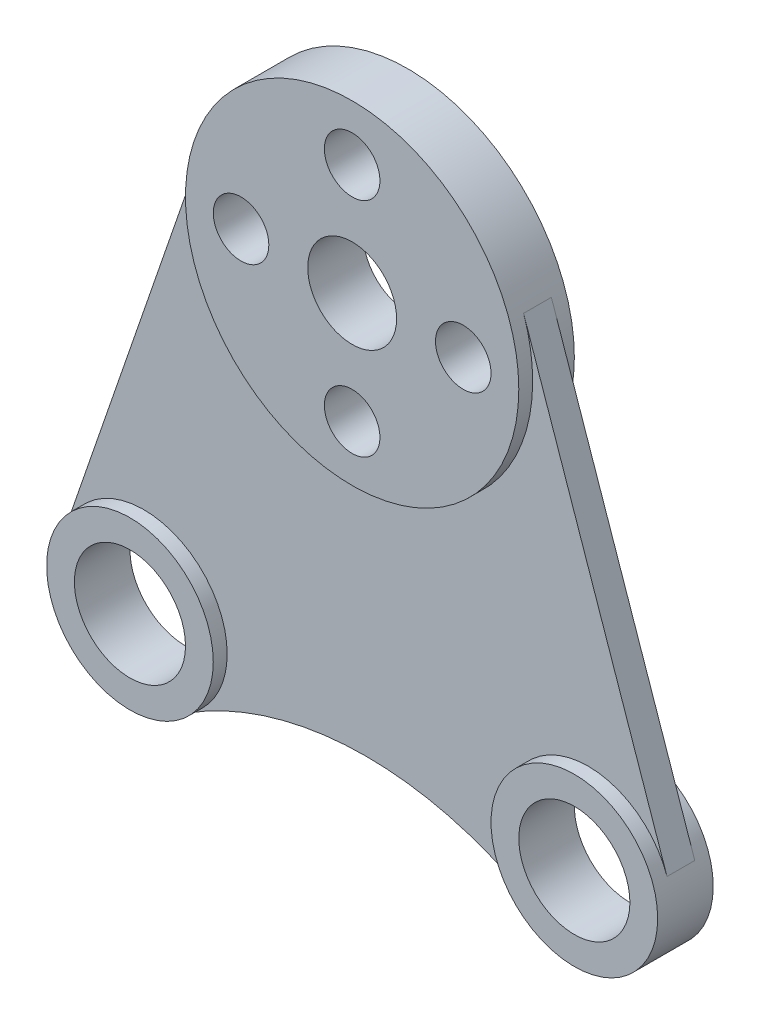
ISO-10303-21;
HEADER;
FILE_DESCRIPTION(('STEP AP214'),'2;1');
FILE_NAME('part.step','',(''),(''),'','','');
FILE_SCHEMA(('AUTOMOTIVE_DESIGN { 1 0 10303 214 1 1 1 1 }'));
ENDSEC;
DATA;
#1=APPLICATION_CONTEXT('core data for automotive mechanical design processes');
#2=APPLICATION_PROTOCOL_DEFINITION('international standard','automotive_design',2000,#1);
#3=PRODUCT_CONTEXT('',#1,'mechanical');
#4=PRODUCT('Part','Part','',(#3));
#5=PRODUCT_RELATED_PRODUCT_CATEGORY('part','',(#4));
#6=PRODUCT_DEFINITION_FORMATION('','',#4);
#7=PRODUCT_DEFINITION_CONTEXT('part definition',#1,'design');
#8=PRODUCT_DEFINITION('design','',#6,#7);
#9=PRODUCT_DEFINITION_SHAPE('','',#8);
#10=(LENGTH_UNIT() NAMED_UNIT(*) SI_UNIT(.MILLI.,.METRE.));
#11=(NAMED_UNIT(*) PLANE_ANGLE_UNIT() SI_UNIT($,.RADIAN.));
#12=(NAMED_UNIT(*) SI_UNIT($,.STERADIAN.) SOLID_ANGLE_UNIT());
#13=UNCERTAINTY_MEASURE_WITH_UNIT(LENGTH_MEASURE(1.E-05),#10,'distance_accuracy_value','');
#14=(GEOMETRIC_REPRESENTATION_CONTEXT(3) GLOBAL_UNCERTAINTY_ASSIGNED_CONTEXT((#13)) GLOBAL_UNIT_ASSIGNED_CONTEXT((#10,
#11,#12)) REPRESENTATION_CONTEXT('',''));
#15=CARTESIAN_POINT('',(0.,0.,0.));
#16=DIRECTION('',(0.,0.,1.));
#17=DIRECTION('',(1.,0.,0.));
#18=AXIS2_PLACEMENT_3D('',#15,#16,#17);
#19=CARTESIAN_POINT('',(0.,0.,5.));
#20=DIRECTION('',(0.,0.,-1.));
#21=DIRECTION('',(-1.,0.,0.));
#22=AXIS2_PLACEMENT_3D('',#19,#20,#21);
#23=CYLINDRICAL_SURFACE('',#22,8.);
#24=CARTESIAN_POINT('',(0.,0.,5.));
#25=DIRECTION('',(0.,0.,1.));
#26=DIRECTION('',(1.,0.,0.));
#27=AXIS2_PLACEMENT_3D('',#24,#25,#26);
#28=CIRCLE('',#27,8.);
#29=CARTESIAN_POINT('',(8.,0.,5.));
#30=VERTEX_POINT('',#29);
#31=EDGE_CURVE('E53',#30,#30,#28,.T.);
#32=ORIENTED_EDGE('',*,*,#31,.T.);
#33=EDGE_LOOP('',(#32));
#34=FACE_BOUND('',#33,.T.);
#35=CARTESIAN_POINT('',(0.,0.,-5.));
#36=DIRECTION('',(0.,0.,1.));
#37=DIRECTION('',(1.,0.,0.));
#38=AXIS2_PLACEMENT_3D('',#35,#36,#37);
#39=CIRCLE('',#38,8.);
#40=CARTESIAN_POINT('',(8.,0.,-5.));
#41=VERTEX_POINT('',#40);
#42=EDGE_CURVE('E188',#41,#41,#39,.T.);
#43=ORIENTED_EDGE('',*,*,#42,.F.);
#44=EDGE_LOOP('',(#43));
#45=FACE_BOUND('',#44,.T.);
#46=ADVANCED_FACE('F43',(#34,#45),#23,.F.);
#47=CARTESIAN_POINT('',(0.,20.,5.));
#48=DIRECTION('',(0.,0.,-1.));
#49=DIRECTION('',(-1.,0.,0.));
#50=AXIS2_PLACEMENT_3D('',#47,#48,#49);
#51=CYLINDRICAL_SURFACE('',#50,5.);
#52=CARTESIAN_POINT('',(0.,20.,5.));
#53=DIRECTION('',(0.,0.,1.));
#54=DIRECTION('',(1.,0.,0.));
#55=AXIS2_PLACEMENT_3D('',#52,#53,#54);
#56=CIRCLE('',#55,5.);
#57=CARTESIAN_POINT('',(5.,20.,5.));
#58=VERTEX_POINT('',#57);
#59=EDGE_CURVE('E167',#58,#58,#56,.T.);
#60=ORIENTED_EDGE('',*,*,#59,.T.);
#61=EDGE_LOOP('',(#60));
#62=FACE_BOUND('',#61,.T.);
#63=CARTESIAN_POINT('',(0.,20.,-5.));
#64=DIRECTION('',(0.,0.,1.));
#65=DIRECTION('',(1.,0.,0.));
#66=AXIS2_PLACEMENT_3D('',#63,#64,#65);
#67=CIRCLE('',#66,5.);
#68=CARTESIAN_POINT('',(5.,20.,-5.));
#69=VERTEX_POINT('',#68);
#70=EDGE_CURVE('E185',#69,#69,#67,.T.);
#71=ORIENTED_EDGE('',*,*,#70,.F.);
#72=EDGE_LOOP('',(#71));
#73=FACE_BOUND('',#72,.T.);
#74=ADVANCED_FACE('F216',(#62,#73),#51,.F.);
#75=CARTESIAN_POINT('',(20.,0.,5.));
#76=DIRECTION('',(0.,0.,-1.));
#77=DIRECTION('',(-1.,0.,0.));
#78=AXIS2_PLACEMENT_3D('',#75,#76,#77);
#79=CYLINDRICAL_SURFACE('',#78,5.00000000000006);
#80=CARTESIAN_POINT('',(20.,0.,5.));
#81=DIRECTION('',(0.,0.,1.));
#82=DIRECTION('',(1.,0.,0.));
#83=AXIS2_PLACEMENT_3D('',#80,#81,#82);
#84=CIRCLE('',#83,5.00000000000006);
#85=CARTESIAN_POINT('',(25.0000000000001,0.,5.));
#86=VERTEX_POINT('',#85);
#87=EDGE_CURVE('E163',#86,#86,#84,.T.);
#88=ORIENTED_EDGE('',*,*,#87,.T.);
#89=EDGE_LOOP('',(#88));
#90=FACE_BOUND('',#89,.T.);
#91=CARTESIAN_POINT('',(20.,0.,-5.));
#92=DIRECTION('',(0.,0.,1.));
#93=DIRECTION('',(1.,0.,0.));
#94=AXIS2_PLACEMENT_3D('',#91,#92,#93);
#95=CIRCLE('',#94,5.00000000000006);
#96=CARTESIAN_POINT('',(25.0000000000001,0.,-5.));
#97=VERTEX_POINT('',#96);
#98=EDGE_CURVE('E181',#97,#97,#95,.T.);
#99=ORIENTED_EDGE('',*,*,#98,.F.);
#100=EDGE_LOOP('',(#99));
#101=FACE_BOUND('',#100,.T.);
#102=ADVANCED_FACE('F222',(#90,#101),#79,.F.);
#103=CARTESIAN_POINT('',(0.,-20.,5.));
#104=DIRECTION('',(0.,0.,-1.));
#105=DIRECTION('',(-1.,0.,0.));
#106=AXIS2_PLACEMENT_3D('',#103,#104,#105);
#107=CYLINDRICAL_SURFACE('',#106,5.00000000000014);
#108=CARTESIAN_POINT('',(0.,-20.,5.));
#109=DIRECTION('',(0.,0.,1.));
#110=DIRECTION('',(1.,0.,0.));
#111=AXIS2_PLACEMENT_3D('',#108,#109,#110);
#112=CIRCLE('',#111,5.00000000000014);
#113=CARTESIAN_POINT('',(5.00000000000014,-20.,5.));
#114=VERTEX_POINT('',#113);
#115=EDGE_CURVE('E159',#114,#114,#112,.T.);
#116=ORIENTED_EDGE('',*,*,#115,.T.);
#117=EDGE_LOOP('',(#116));
#118=FACE_BOUND('',#117,.T.);
#119=CARTESIAN_POINT('',(0.,-20.,-5.));
#120=DIRECTION('',(0.,0.,1.));
#121=DIRECTION('',(1.,0.,0.));
#122=AXIS2_PLACEMENT_3D('',#119,#120,#121);
#123=CIRCLE('',#122,5.00000000000014);
#124=CARTESIAN_POINT('',(5.00000000000014,-20.,-5.));
#125=VERTEX_POINT('',#124);
#126=EDGE_CURVE('E177',#125,#125,#123,.T.);
#127=ORIENTED_EDGE('',*,*,#126,.F.);
#128=EDGE_LOOP('',(#127));
#129=FACE_BOUND('',#128,.T.);
#130=ADVANCED_FACE('F228',(#118,#129),#107,.F.);
#131=CARTESIAN_POINT('',(-20.,0.,5.));
#132=DIRECTION('',(0.,0.,-1.));
#133=DIRECTION('',(-1.,0.,0.));
#134=AXIS2_PLACEMENT_3D('',#131,#132,#133);
#135=CYLINDRICAL_SURFACE('',#134,5.0000000000002);
#136=CARTESIAN_POINT('',(-20.,0.,5.));
#137=DIRECTION('',(0.,0.,1.));
#138=DIRECTION('',(1.,0.,0.));
#139=AXIS2_PLACEMENT_3D('',#136,#137,#138);
#140=CIRCLE('',#139,5.0000000000002);
#141=CARTESIAN_POINT('',(-14.9999999999998,0.,5.));
#142=VERTEX_POINT('',#141);
#143=EDGE_CURVE('E155',#142,#142,#140,.T.);
#144=ORIENTED_EDGE('',*,*,#143,.T.);
#145=EDGE_LOOP('',(#144));
#146=FACE_BOUND('',#145,.T.);
#147=CARTESIAN_POINT('',(-20.,0.,-5.));
#148=DIRECTION('',(0.,0.,1.));
#149=DIRECTION('',(1.,0.,0.));
#150=AXIS2_PLACEMENT_3D('',#147,#148,#149);
#151=CIRCLE('',#150,5.0000000000002);
#152=CARTESIAN_POINT('',(-14.9999999999998,0.,-5.));
#153=VERTEX_POINT('',#152);
#154=EDGE_CURVE('E154',#153,#153,#151,.T.);
#155=ORIENTED_EDGE('',*,*,#154,.F.);
#156=EDGE_LOOP('',(#155));
#157=FACE_BOUND('',#156,.T.);
#158=ADVANCED_FACE('F45',(#146,#157),#135,.F.);
#159=CARTESIAN_POINT('',(0.,0.,5.));
#160=DIRECTION('',(0.,0.,-1.));
#161=DIRECTION('',(-1.,0.,0.));
#162=AXIS2_PLACEMENT_3D('',#159,#160,#161);
#163=CYLINDRICAL_SURFACE('',#162,30.);
#164=DIRECTION('',(0.,0.,-1.));
#165=VECTOR('',#164,1.);
#166=CARTESIAN_POINT('',(-28.3617361440655,9.77813493946602,2.5));
#167=LINE('',#166,#165);
#168=CARTESIAN_POINT('',(-28.3617361440655,9.77813493946602,2.5));
#169=VERTEX_POINT('',#168);
#170=CARTESIAN_POINT('',(-28.3617361440655,9.77813493946602,-2.5));
#171=VERTEX_POINT('',#170);
#172=EDGE_CURVE('E66',#169,#171,#167,.T.);
#173=ORIENTED_EDGE('',*,*,#172,.F.);
#174=CARTESIAN_POINT('',(0.,0.,2.5));
#175=DIRECTION('',(0.,0.,1.));
#176=DIRECTION('',(1.,0.,0.));
#177=AXIS2_PLACEMENT_3D('',#174,#175,#176);
#178=CIRCLE('',#177,30.);
#179=CARTESIAN_POINT('',(28.3617361440655,9.77813493946602,2.5));
#180=VERTEX_POINT('',#179);
#181=EDGE_CURVE('E61',#169,#180,#178,.T.);
#182=ORIENTED_EDGE('',*,*,#181,.T.);
#183=DIRECTION('',(0.,0.,-1.));
#184=VECTOR('',#183,1.);
#185=CARTESIAN_POINT('',(28.3617361440655,9.77813493946602,2.5));
#186=LINE('',#185,#184);
#187=CARTESIAN_POINT('',(28.3617361440655,9.77813493946602,-2.5));
#188=VERTEX_POINT('',#187);
#189=EDGE_CURVE('E121',#180,#188,#186,.T.);
#190=ORIENTED_EDGE('',*,*,#189,.T.);
#191=CARTESIAN_POINT('',(0.,0.,-2.5));
#192=DIRECTION('',(0.,0.,1.));
#193=DIRECTION('',(1.,0.,0.));
#194=AXIS2_PLACEMENT_3D('',#191,#192,#193);
#195=CIRCLE('',#194,30.);
#196=EDGE_CURVE('E107',#171,#188,#195,.T.);
#197=ORIENTED_EDGE('',*,*,#196,.F.);
#198=EDGE_LOOP('',(#173,#182,#190,#197));
#199=FACE_BOUND('',#198,.T.);
#200=CARTESIAN_POINT('',(0.,0.,5.));
#201=DIRECTION('',(0.,0.,1.));
#202=DIRECTION('',(1.,0.,0.));
#203=AXIS2_PLACEMENT_3D('',#200,#201,#202);
#204=CIRCLE('',#203,30.);
#205=CARTESIAN_POINT('',(30.,0.,5.));
#206=VERTEX_POINT('',#205);
#207=EDGE_CURVE('E11',#206,#206,#204,.T.);
#208=ORIENTED_EDGE('',*,*,#207,.F.);
#209=EDGE_LOOP('',(#208));
#210=FACE_BOUND('',#209,.T.);
#211=CARTESIAN_POINT('',(0.,0.,-5.));
#212=DIRECTION('',(0.,0.,1.));
#213=DIRECTION('',(1.,0.,0.));
#214=AXIS2_PLACEMENT_3D('',#211,#212,#213);
#215=CIRCLE('',#214,30.);
#216=CARTESIAN_POINT('',(30.,0.,-5.));
#217=VERTEX_POINT('',#216);
#218=EDGE_CURVE('E47',#217,#217,#215,.T.);
#219=ORIENTED_EDGE('',*,*,#218,.T.);
#220=EDGE_LOOP('',(#219));
#221=FACE_BOUND('',#220,.T.);
#222=ADVANCED_FACE('F197',(#199,#210,#221),#163,.T.);
#223=CARTESIAN_POINT('',(0.,0.,5.));
#224=DIRECTION('',(0.,0.,1.));
#225=DIRECTION('',(1.,0.,0.));
#226=AXIS2_PLACEMENT_3D('',#223,#224,#225);
#227=PLANE('',#226);
#228=ORIENTED_EDGE('',*,*,#143,.F.);
#229=EDGE_LOOP('',(#228));
#230=FACE_BOUND('',#229,.T.);
#231=ORIENTED_EDGE('',*,*,#115,.F.);
#232=EDGE_LOOP('',(#231));
#233=FACE_BOUND('',#232,.T.);
#234=ORIENTED_EDGE('',*,*,#87,.F.);
#235=EDGE_LOOP('',(#234));
#236=FACE_BOUND('',#235,.T.);
#237=ORIENTED_EDGE('',*,*,#59,.F.);
#238=EDGE_LOOP('',(#237));
#239=FACE_BOUND('',#238,.T.);
#240=ORIENTED_EDGE('',*,*,#31,.F.);
#241=EDGE_LOOP('',(#240));
#242=FACE_BOUND('',#241,.T.);
#243=ORIENTED_EDGE('',*,*,#207,.T.);
#244=EDGE_LOOP('',(#243));
#245=FACE_BOUND('',#244,.T.);
#246=ADVANCED_FACE('F202',(#230,#233,#236,#239,#242,#245),#227,.T.);
#247=CARTESIAN_POINT('',(0.,0.,-5.));
#248=DIRECTION('',(0.,0.,1.));
#249=DIRECTION('',(1.,0.,0.));
#250=AXIS2_PLACEMENT_3D('',#247,#248,#249);
#251=PLANE('',#250);
#252=ORIENTED_EDGE('',*,*,#154,.T.);
#253=EDGE_LOOP('',(#252));
#254=FACE_BOUND('',#253,.T.);
#255=ORIENTED_EDGE('',*,*,#126,.T.);
#256=EDGE_LOOP('',(#255));
#257=FACE_BOUND('',#256,.T.);
#258=ORIENTED_EDGE('',*,*,#98,.T.);
#259=EDGE_LOOP('',(#258));
#260=FACE_BOUND('',#259,.T.);
#261=ORIENTED_EDGE('',*,*,#70,.T.);
#262=EDGE_LOOP('',(#261));
#263=FACE_BOUND('',#262,.T.);
#264=ORIENTED_EDGE('',*,*,#42,.T.);
#265=EDGE_LOOP('',(#264));
#266=FACE_BOUND('',#265,.T.);
#267=ORIENTED_EDGE('',*,*,#218,.F.);
#268=EDGE_LOOP('',(#267));
#269=FACE_BOUND('',#268,.T.);
#270=ADVANCED_FACE('F199',(#254,#257,#260,#263,#266,#269),#251,.F.);
#271=CARTESIAN_POINT('',(0.,-133.442887702248,2.5));
#272=DIRECTION('',(0.,0.,-1.));
#273=DIRECTION('',(-1.,0.,0.));
#274=AXIS2_PLACEMENT_3D('',#271,#272,#273);
#275=CYLINDRICAL_SURFACE('',#274,60.);
#276=CARTESIAN_POINT('',(0.,-133.442887702248,-2.5));
#277=DIRECTION('',(0.,0.,1.));
#278=DIRECTION('',(1.,0.,0.));
#279=AXIS2_PLACEMENT_3D('',#276,#277,#278);
#280=CIRCLE('',#279,60.);
#281=CARTESIAN_POINT('',(-32.,-82.6885775404495,-2.5));
#282=VERTEX_POINT('',#281);
#283=CARTESIAN_POINT('',(32.,-82.6885775404495,-2.5));
#284=VERTEX_POINT('',#283);
#285=EDGE_CURVE('E127',#282,#284,#280,.F.);
#286=ORIENTED_EDGE('',*,*,#285,.T.);
#287=DIRECTION('',(0.,0.,-1.));
#288=VECTOR('',#287,1.);
#289=CARTESIAN_POINT('',(32.,-82.6885775404495,2.5));
#290=LINE('',#289,#288);
#291=CARTESIAN_POINT('',(32.,-82.6885775404495,2.5));
#292=VERTEX_POINT('',#291);
#293=EDGE_CURVE('E120',#292,#284,#290,.T.);
#294=ORIENTED_EDGE('',*,*,#293,.F.);
#295=CARTESIAN_POINT('',(0.,-133.442887702248,2.5));
#296=DIRECTION('',(0.,0.,1.));
#297=DIRECTION('',(1.,0.,0.));
#298=AXIS2_PLACEMENT_3D('',#295,#296,#297);
#299=CIRCLE('',#298,60.);
#300=CARTESIAN_POINT('',(-32.,-82.6885775404495,2.5));
#301=VERTEX_POINT('',#300);
#302=EDGE_CURVE('E426',#301,#292,#299,.F.);
#303=ORIENTED_EDGE('',*,*,#302,.F.);
#304=DIRECTION('',(0.,0.,-1.));
#305=VECTOR('',#304,1.);
#306=CARTESIAN_POINT('',(-32.,-82.6885775404495,2.5));
#307=LINE('',#306,#305);
#308=EDGE_CURVE('E150',#301,#282,#307,.T.);
#309=ORIENTED_EDGE('',*,*,#308,.T.);
#310=EDGE_LOOP('',(#286,#294,#303,#309));
#311=FACE_BOUND('',#310,.T.);
#312=ADVANCED_FACE('F201',(#311),#275,.F.);
#313=CARTESIAN_POINT('',(28.3617361440655,9.77813493946602,2.5));
#314=DIRECTION('',(-0.945391204802185,-0.325937831315534,0.));
#315=DIRECTION('',(0.325937831315534,-0.945391204802185,0.));
#316=AXIS2_PLACEMENT_3D('',#313,#314,#315);
#317=PLANE('',#316);
#318=DIRECTION('',(-0.325937831315534,0.945391204802185,0.));
#319=VECTOR('',#318,1.);
#320=CARTESIAN_POINT('',(28.3617361440655,9.77813493946602,-2.5));
#321=LINE('',#320,#319);
#322=CARTESIAN_POINT('',(54.1808680720328,-65.110932530267,-2.5));
#323=VERTEX_POINT('',#322);
#324=EDGE_CURVE('E98',#323,#188,#321,.T.);
#325=ORIENTED_EDGE('',*,*,#324,.T.);
#326=ORIENTED_EDGE('',*,*,#189,.F.);
#327=DIRECTION('',(-0.325937831315534,0.945391204802185,0.));
#328=VECTOR('',#327,1.);
#329=CARTESIAN_POINT('',(28.3617361440655,9.77813493946602,2.5));
#330=LINE('',#329,#328);
#331=CARTESIAN_POINT('',(54.1808680720328,-65.110932530267,2.5));
#332=VERTEX_POINT('',#331);
#333=EDGE_CURVE('E116',#332,#180,#330,.T.);
#334=ORIENTED_EDGE('',*,*,#333,.F.);
#335=DIRECTION('',(0.,0.,-1.));
#336=VECTOR('',#335,1.);
#337=CARTESIAN_POINT('',(54.1808680720328,-65.110932530267,2.5));
#338=LINE('',#337,#336);
#339=EDGE_CURVE('E114',#332,#323,#338,.T.);
#340=ORIENTED_EDGE('',*,*,#339,.T.);
#341=EDGE_LOOP('',(#325,#326,#334,#340));
#342=FACE_BOUND('',#341,.T.);
#343=ADVANCED_FACE('F115',(#342),#317,.F.);
#344=CARTESIAN_POINT('',(-28.3617361440655,9.77813493946602,2.5));
#345=DIRECTION('',(-0.945391204802185,0.325937831315534,0.));
#346=DIRECTION('',(-0.325937831315534,-0.945391204802185,0.));
#347=AXIS2_PLACEMENT_3D('',#344,#345,#346);
#348=PLANE('',#347);
#349=DIRECTION('',(0.325937831315534,0.945391204802185,0.));
#350=VECTOR('',#349,1.);
#351=CARTESIAN_POINT('',(-28.3617361440655,9.77813493946602,-2.5));
#352=LINE('',#351,#350);
#353=CARTESIAN_POINT('',(-54.1808680720328,-65.110932530267,-2.5));
#354=VERTEX_POINT('',#353);
#355=EDGE_CURVE('E136',#354,#171,#352,.T.);
#356=ORIENTED_EDGE('',*,*,#355,.F.);
#357=DIRECTION('',(0.,0.,-1.));
#358=VECTOR('',#357,1.);
#359=CARTESIAN_POINT('',(-54.1808680720328,-65.110932530267,2.5));
#360=LINE('',#359,#358);
#361=CARTESIAN_POINT('',(-54.1808680720328,-65.110932530267,2.5));
#362=VERTEX_POINT('',#361);
#363=EDGE_CURVE('E140',#362,#354,#360,.T.);
#364=ORIENTED_EDGE('',*,*,#363,.F.);
#365=DIRECTION('',(0.325937831315534,0.945391204802185,0.));
#366=VECTOR('',#365,1.);
#367=CARTESIAN_POINT('',(-28.3617361440655,9.77813493946602,2.5));
#368=LINE('',#367,#366);
#369=EDGE_CURVE('E143',#362,#169,#368,.T.);
#370=ORIENTED_EDGE('',*,*,#369,.T.);
#371=ORIENTED_EDGE('',*,*,#172,.T.);
#372=EDGE_LOOP('',(#356,#364,#370,#371));
#373=FACE_BOUND('',#372,.T.);
#374=ADVANCED_FACE('F369',(#373),#348,.T.);
#375=CARTESIAN_POINT('',(0.,0.,2.5));
#376=DIRECTION('',(0.,0.,1.));
#377=DIRECTION('',(1.,0.,0.));
#378=AXIS2_PLACEMENT_3D('',#375,#376,#377);
#379=PLANE('',#378);
#380=CARTESIAN_POINT('',(-40.,-70.,2.5));
#381=DIRECTION('',(0.,0.,1.));
#382=DIRECTION('',(1.,0.,0.));
#383=AXIS2_PLACEMENT_3D('',#380,#381,#382);
#384=CIRCLE('',#383,15.);
#385=EDGE_CURVE('E139',#301,#362,#384,.T.);
#386=ORIENTED_EDGE('',*,*,#385,.F.);
#387=ORIENTED_EDGE('',*,*,#302,.T.);
#388=CARTESIAN_POINT('',(40.,-70.,2.5));
#389=DIRECTION('',(0.,0.,1.));
#390=DIRECTION('',(1.,0.,0.));
#391=AXIS2_PLACEMENT_3D('',#388,#389,#390);
#392=CIRCLE('',#391,15.);
#393=EDGE_CURVE('E432',#292,#332,#392,.F.);
#394=ORIENTED_EDGE('',*,*,#393,.T.);
#395=ORIENTED_EDGE('',*,*,#333,.T.);
#396=ORIENTED_EDGE('',*,*,#181,.F.);
#397=ORIENTED_EDGE('',*,*,#369,.F.);
#398=EDGE_LOOP('',(#386,#387,#394,#395,#396,#397));
#399=FACE_BOUND('',#398,.T.);
#400=ADVANCED_FACE('F379',(#399),#379,.T.);
#401=CARTESIAN_POINT('',(0.,0.,-2.5));
#402=DIRECTION('',(0.,0.,1.));
#403=DIRECTION('',(1.,0.,0.));
#404=AXIS2_PLACEMENT_3D('',#401,#402,#403);
#405=PLANE('',#404);
#406=CARTESIAN_POINT('',(-40.,-70.,-2.5));
#407=DIRECTION('',(0.,0.,1.));
#408=DIRECTION('',(1.,0.,0.));
#409=AXIS2_PLACEMENT_3D('',#406,#407,#408);
#410=CIRCLE('',#409,15.);
#411=EDGE_CURVE('E130',#282,#354,#410,.T.);
#412=ORIENTED_EDGE('',*,*,#411,.T.);
#413=ORIENTED_EDGE('',*,*,#355,.T.);
#414=ORIENTED_EDGE('',*,*,#196,.T.);
#415=ORIENTED_EDGE('',*,*,#324,.F.);
#416=CARTESIAN_POINT('',(40.,-70.,-2.5));
#417=DIRECTION('',(0.,0.,1.));
#418=DIRECTION('',(1.,0.,0.));
#419=AXIS2_PLACEMENT_3D('',#416,#417,#418);
#420=CIRCLE('',#419,15.);
#421=EDGE_CURVE('E104',#284,#323,#420,.F.);
#422=ORIENTED_EDGE('',*,*,#421,.F.);
#423=ORIENTED_EDGE('',*,*,#285,.F.);
#424=EDGE_LOOP('',(#412,#413,#414,#415,#422,#423));
#425=FACE_BOUND('',#424,.T.);
#426=ADVANCED_FACE('F101',(#425),#405,.F.);
#427=CARTESIAN_POINT('',(-40.,-70.,5.));
#428=DIRECTION('',(0.,0.,-1.));
#429=DIRECTION('',(-1.,0.,0.));
#430=AXIS2_PLACEMENT_3D('',#427,#428,#429);
#431=CYLINDRICAL_SURFACE('',#430,10.);
#432=CARTESIAN_POINT('',(-40.,-70.,5.));
#433=DIRECTION('',(0.,0.,1.));
#434=DIRECTION('',(1.,0.,0.));
#435=AXIS2_PLACEMENT_3D('',#432,#433,#434);
#436=CIRCLE('',#435,10.);
#437=CARTESIAN_POINT('',(-30.,-70.,5.));
#438=VERTEX_POINT('',#437);
#439=EDGE_CURVE('E450',#438,#438,#436,.T.);
#440=ORIENTED_EDGE('',*,*,#439,.T.);
#441=EDGE_LOOP('',(#440));
#442=FACE_BOUND('',#441,.T.);
#443=CARTESIAN_POINT('',(-40.,-70.,-5.));
#444=DIRECTION('',(0.,0.,1.));
#445=DIRECTION('',(1.,0.,0.));
#446=AXIS2_PLACEMENT_3D('',#443,#444,#445);
#447=CIRCLE('',#446,10.);
#448=CARTESIAN_POINT('',(-30.,-70.,-5.));
#449=VERTEX_POINT('',#448);
#450=EDGE_CURVE('E458',#449,#449,#447,.T.);
#451=ORIENTED_EDGE('',*,*,#450,.F.);
#452=EDGE_LOOP('',(#451));
#453=FACE_BOUND('',#452,.T.);
#454=ADVANCED_FACE('F280',(#442,#453),#431,.F.);
#455=CARTESIAN_POINT('',(-40.,-70.,5.));
#456=DIRECTION('',(0.,0.,-1.));
#457=DIRECTION('',(-1.,0.,0.));
#458=AXIS2_PLACEMENT_3D('',#455,#456,#457);
#459=CYLINDRICAL_SURFACE('',#458,15.);
#460=ORIENTED_EDGE('',*,*,#385,.T.);
#461=ORIENTED_EDGE('',*,*,#363,.T.);
#462=ORIENTED_EDGE('',*,*,#411,.F.);
#463=ORIENTED_EDGE('',*,*,#308,.F.);
#464=EDGE_LOOP('',(#460,#461,#462,#463));
#465=FACE_BOUND('',#464,.T.);
#466=CARTESIAN_POINT('',(-40.,-70.,5.));
#467=DIRECTION('',(0.,0.,1.));
#468=DIRECTION('',(1.,0.,0.));
#469=AXIS2_PLACEMENT_3D('',#466,#467,#468);
#470=CIRCLE('',#469,15.);
#471=CARTESIAN_POINT('',(-25.,-70.,5.));
#472=VERTEX_POINT('',#471);
#473=EDGE_CURVE('E446',#472,#472,#470,.T.);
#474=ORIENTED_EDGE('',*,*,#473,.F.);
#475=EDGE_LOOP('',(#474));
#476=FACE_BOUND('',#475,.T.);
#477=CARTESIAN_POINT('',(-40.,-70.,-5.));
#478=DIRECTION('',(0.,0.,1.));
#479=DIRECTION('',(1.,0.,0.));
#480=AXIS2_PLACEMENT_3D('',#477,#478,#479);
#481=CIRCLE('',#480,15.);
#482=CARTESIAN_POINT('',(-25.,-70.,-5.));
#483=VERTEX_POINT('',#482);
#484=EDGE_CURVE('E435',#483,#483,#481,.T.);
#485=ORIENTED_EDGE('',*,*,#484,.T.);
#486=EDGE_LOOP('',(#485));
#487=FACE_BOUND('',#486,.T.);
#488=ADVANCED_FACE('F285',(#465,#476,#487),#459,.T.);
#489=CARTESIAN_POINT('',(0.,0.,5.));
#490=DIRECTION('',(0.,0.,1.));
#491=DIRECTION('',(1.,0.,0.));
#492=AXIS2_PLACEMENT_3D('',#489,#490,#491);
#493=PLANE('',#492);
#494=ORIENTED_EDGE('',*,*,#439,.F.);
#495=EDGE_LOOP('',(#494));
#496=FACE_BOUND('',#495,.T.);
#497=ORIENTED_EDGE('',*,*,#473,.T.);
#498=EDGE_LOOP('',(#497));
#499=FACE_BOUND('',#498,.T.);
#500=ADVANCED_FACE('F295',(#496,#499),#493,.T.);
#501=CARTESIAN_POINT('',(0.,0.,-5.));
#502=DIRECTION('',(0.,0.,1.));
#503=DIRECTION('',(1.,0.,0.));
#504=AXIS2_PLACEMENT_3D('',#501,#502,#503);
#505=PLANE('',#504);
#506=ORIENTED_EDGE('',*,*,#450,.T.);
#507=EDGE_LOOP('',(#506));
#508=FACE_BOUND('',#507,.T.);
#509=ORIENTED_EDGE('',*,*,#484,.F.);
#510=EDGE_LOOP('',(#509));
#511=FACE_BOUND('',#510,.T.);
#512=ADVANCED_FACE('F305',(#508,#511),#505,.F.);
#513=CARTESIAN_POINT('',(40.,-70.,5.));
#514=DIRECTION('',(0.,0.,-1.));
#515=DIRECTION('',(-1.,0.,0.));
#516=AXIS2_PLACEMENT_3D('',#513,#514,#515);
#517=CYLINDRICAL_SURFACE('',#516,15.);
#518=ORIENTED_EDGE('',*,*,#339,.F.);
#519=ORIENTED_EDGE('',*,*,#393,.F.);
#520=ORIENTED_EDGE('',*,*,#293,.T.);
#521=ORIENTED_EDGE('',*,*,#421,.T.);
#522=EDGE_LOOP('',(#518,#519,#520,#521));
#523=FACE_BOUND('',#522,.T.);
#524=CARTESIAN_POINT('',(40.,-70.,5.));
#525=DIRECTION('',(0.,0.,1.));
#526=DIRECTION('',(1.,0.,0.));
#527=AXIS2_PLACEMENT_3D('',#524,#525,#526);
#528=CIRCLE('',#527,15.);
#529=CARTESIAN_POINT('',(55.,-70.,5.));
#530=VERTEX_POINT('',#529);
#531=EDGE_CURVE('E467',#530,#530,#528,.F.);
#532=ORIENTED_EDGE('',*,*,#531,.T.);
#533=EDGE_LOOP('',(#532));
#534=FACE_BOUND('',#533,.T.);
#535=CARTESIAN_POINT('',(40.,-70.,-5.));
#536=DIRECTION('',(0.,0.,1.));
#537=DIRECTION('',(1.,0.,0.));
#538=AXIS2_PLACEMENT_3D('',#535,#536,#537);
#539=CIRCLE('',#538,15.);
#540=CARTESIAN_POINT('',(55.,-70.,-5.));
#541=VERTEX_POINT('',#540);
#542=EDGE_CURVE('E476',#541,#541,#539,.F.);
#543=ORIENTED_EDGE('',*,*,#542,.F.);
#544=EDGE_LOOP('',(#543));
#545=FACE_BOUND('',#544,.T.);
#546=ADVANCED_FACE('F123',(#523,#534,#545),#517,.T.);
#547=CARTESIAN_POINT('',(40.,-70.,5.));
#548=DIRECTION('',(0.,0.,-1.));
#549=DIRECTION('',(-1.,0.,0.));
#550=AXIS2_PLACEMENT_3D('',#547,#548,#549);
#551=CYLINDRICAL_SURFACE('',#550,9.99999999999999);
#552=CARTESIAN_POINT('',(40.,-70.,5.));
#553=DIRECTION('',(0.,0.,1.));
#554=DIRECTION('',(1.,0.,0.));
#555=AXIS2_PLACEMENT_3D('',#552,#553,#554);
#556=CIRCLE('',#555,9.99999999999999);
#557=CARTESIAN_POINT('',(50.,-70.,5.));
#558=VERTEX_POINT('',#557);
#559=EDGE_CURVE('E461',#558,#558,#556,.F.);
#560=ORIENTED_EDGE('',*,*,#559,.F.);
#561=EDGE_LOOP('',(#560));
#562=FACE_BOUND('',#561,.T.);
#563=CARTESIAN_POINT('',(40.,-70.,-5.));
#564=DIRECTION('',(0.,0.,1.));
#565=DIRECTION('',(1.,0.,0.));
#566=AXIS2_PLACEMENT_3D('',#563,#564,#565);
#567=CIRCLE('',#566,9.99999999999999);
#568=CARTESIAN_POINT('',(50.,-70.,-5.));
#569=VERTEX_POINT('',#568);
#570=EDGE_CURVE('E473',#569,#569,#567,.F.);
#571=ORIENTED_EDGE('',*,*,#570,.T.);
#572=EDGE_LOOP('',(#571));
#573=FACE_BOUND('',#572,.T.);
#574=ADVANCED_FACE('F324',(#562,#573),#551,.F.);
#575=CARTESIAN_POINT('',(0.,0.,5.));
#576=DIRECTION('',(0.,0.,1.));
#577=DIRECTION('',(1.,0.,0.));
#578=AXIS2_PLACEMENT_3D('',#575,#576,#577);
#579=PLANE('',#578);
#580=ORIENTED_EDGE('',*,*,#531,.F.);
#581=EDGE_LOOP('',(#580));
#582=FACE_BOUND('',#581,.T.);
#583=ORIENTED_EDGE('',*,*,#559,.T.);
#584=EDGE_LOOP('',(#583));
#585=FACE_BOUND('',#584,.T.);
#586=ADVANCED_FACE('F333',(#582,#585),#579,.T.);
#587=CARTESIAN_POINT('',(0.,0.,-5.));
#588=DIRECTION('',(0.,0.,1.));
#589=DIRECTION('',(1.,0.,0.));
#590=AXIS2_PLACEMENT_3D('',#587,#588,#589);
#591=PLANE('',#590);
#592=ORIENTED_EDGE('',*,*,#542,.T.);
#593=EDGE_LOOP('',(#592));
#594=FACE_BOUND('',#593,.T.);
#595=ORIENTED_EDGE('',*,*,#570,.F.);
#596=EDGE_LOOP('',(#595));
#597=FACE_BOUND('',#596,.T.);
#598=ADVANCED_FACE('F343',(#594,#597),#591,.F.);
#599=CLOSED_SHELL('',(#46,#74,#102,#130,#158,#222,#246,#270,#312,#343,#374,#400,#426,#454,#488,
#500,#512,#546,#574,#586,#598));
#600=MANIFOLD_SOLID_BREP('B2',#599);
#601=ADVANCED_BREP_SHAPE_REPRESENTATION('',(#18,#600),#14);
#602=SHAPE_DEFINITION_REPRESENTATION(#9,#601);
ENDSEC;
END-ISO-10303-21;
